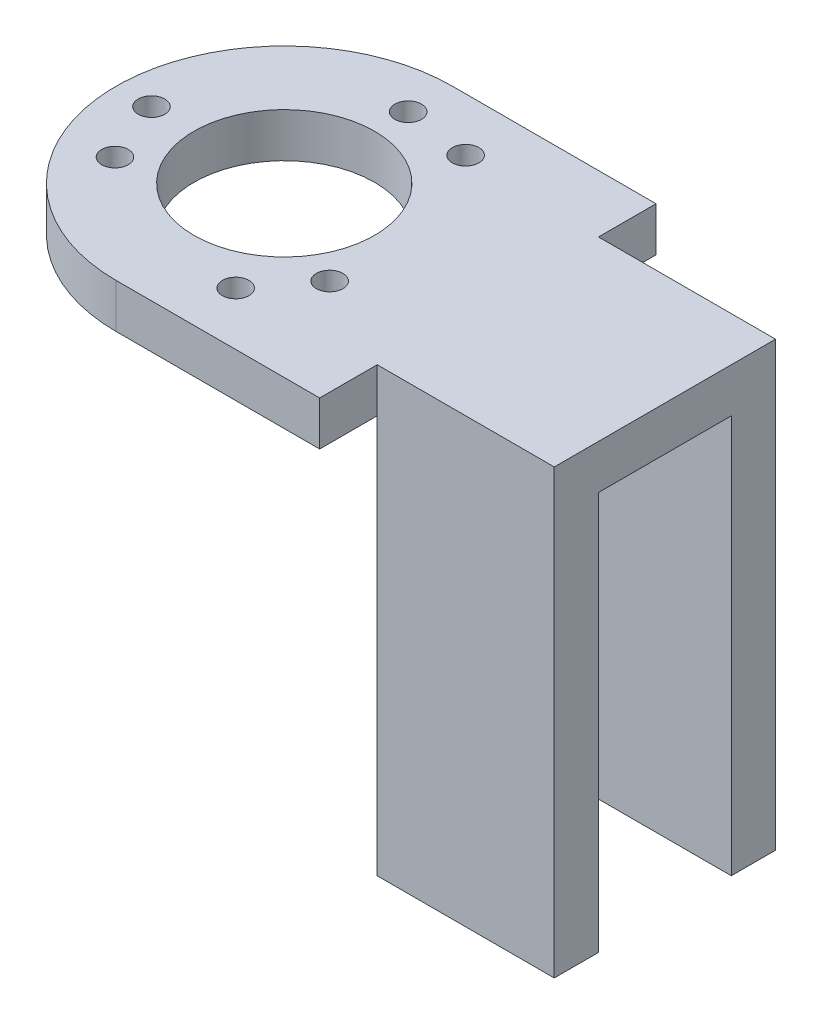
ISO-10303-21;
HEADER;
FILE_DESCRIPTION(('STEP AP214'),'2;1');
FILE_NAME('part.step','',(''),(''),'','','');
FILE_SCHEMA(('AUTOMOTIVE_DESIGN { 1 0 10303 214 1 1 1 1 }'));
ENDSEC;
DATA;
#1=APPLICATION_CONTEXT('core data for automotive mechanical design processes');
#2=APPLICATION_PROTOCOL_DEFINITION('international standard','automotive_design',2000,#1);
#3=PRODUCT_CONTEXT('',#1,'mechanical');
#4=PRODUCT('Part','Part','',(#3));
#5=PRODUCT_RELATED_PRODUCT_CATEGORY('part','',(#4));
#6=PRODUCT_DEFINITION_FORMATION('','',#4);
#7=PRODUCT_DEFINITION_CONTEXT('part definition',#1,'design');
#8=PRODUCT_DEFINITION('design','',#6,#7);
#9=PRODUCT_DEFINITION_SHAPE('','',#8);
#10=(LENGTH_UNIT() NAMED_UNIT(*) SI_UNIT(.MILLI.,.METRE.));
#11=(NAMED_UNIT(*) PLANE_ANGLE_UNIT() SI_UNIT($,.RADIAN.));
#12=(NAMED_UNIT(*) SI_UNIT($,.STERADIAN.) SOLID_ANGLE_UNIT());
#13=UNCERTAINTY_MEASURE_WITH_UNIT(LENGTH_MEASURE(1.E-05),#10,'distance_accuracy_value','');
#14=(GEOMETRIC_REPRESENTATION_CONTEXT(3) GLOBAL_UNCERTAINTY_ASSIGNED_CONTEXT((#13)) GLOBAL_UNIT_ASSIGNED_CONTEXT((#10,
#11,#12)) REPRESENTATION_CONTEXT('',''));
#15=CARTESIAN_POINT('',(0.,0.,0.));
#16=DIRECTION('',(0.,0.,1.));
#17=DIRECTION('',(1.,0.,0.));
#18=AXIS2_PLACEMENT_3D('',#15,#16,#17);
#19=CARTESIAN_POINT('',(23.,0.,0.));
#20=DIRECTION('',(-1.,0.,0.));
#21=DIRECTION('',(0.,0.,1.));
#22=AXIS2_PLACEMENT_3D('',#19,#20,#21);
#23=PLANE('',#22);
#24=DIRECTION('',(0.,-1.,0.));
#25=VECTOR('',#24,1.);
#26=CARTESIAN_POINT('',(23.,5.,12.5));
#27=LINE('',#26,#25);
#28=CARTESIAN_POINT('',(23.,5.,12.5));
#29=VERTEX_POINT('',#28);
#30=CARTESIAN_POINT('',(23.,0.,12.5));
#31=VERTEX_POINT('',#30);
#32=EDGE_CURVE('E208',#29,#31,#27,.T.);
#33=ORIENTED_EDGE('',*,*,#32,.F.);
#34=DIRECTION('',(0.,0.,1.));
#35=VECTOR('',#34,1.);
#36=CARTESIAN_POINT('',(23.,5.,0.));
#37=LINE('',#36,#35);
#38=CARTESIAN_POINT('',(23.,5.,19.));
#39=VERTEX_POINT('',#38);
#40=EDGE_CURVE('E234',#29,#39,#37,.T.);
#41=ORIENTED_EDGE('',*,*,#40,.T.);
#42=DIRECTION('',(0.,1.,0.));
#43=VECTOR('',#42,1.);
#44=CARTESIAN_POINT('',(23.,0.,19.));
#45=LINE('',#44,#43);
#46=CARTESIAN_POINT('',(23.,0.,19.));
#47=VERTEX_POINT('',#46);
#48=EDGE_CURVE('E258',#47,#39,#45,.T.);
#49=ORIENTED_EDGE('',*,*,#48,.F.);
#50=DIRECTION('',(0.,0.,1.));
#51=VECTOR('',#50,1.);
#52=CARTESIAN_POINT('',(23.,0.,0.));
#53=LINE('',#52,#51);
#54=EDGE_CURVE('E240',#31,#47,#53,.T.);
#55=ORIENTED_EDGE('',*,*,#54,.F.);
#56=EDGE_LOOP('',(#33,#41,#49,#55));
#57=FACE_BOUND('',#56,.T.);
#58=ADVANCED_FACE('F41',(#57),#23,.F.);
#59=DIRECTION('',(0.,1.,0.));
#60=VECTOR('',#59,1.);
#61=CARTESIAN_POINT('',(23.,5.,-12.5));
#62=LINE('',#61,#60);
#63=CARTESIAN_POINT('',(23.,0.,-12.5));
#64=VERTEX_POINT('',#63);
#65=CARTESIAN_POINT('',(23.,5.,-12.5));
#66=VERTEX_POINT('',#65);
#67=EDGE_CURVE('E212',#64,#66,#62,.T.);
#68=ORIENTED_EDGE('',*,*,#67,.F.);
#69=CARTESIAN_POINT('',(23.,0.,-19.));
#70=VERTEX_POINT('',#69);
#71=EDGE_CURVE('E235',#70,#64,#53,.T.);
#72=ORIENTED_EDGE('',*,*,#71,.F.);
#73=DIRECTION('',(0.,1.,0.));
#74=VECTOR('',#73,1.);
#75=CARTESIAN_POINT('',(23.,0.,-19.));
#76=LINE('',#75,#74);
#77=CARTESIAN_POINT('',(23.,5.,-19.));
#78=VERTEX_POINT('',#77);
#79=EDGE_CURVE('E247',#70,#78,#76,.T.);
#80=ORIENTED_EDGE('',*,*,#79,.T.);
#81=EDGE_CURVE('E248',#78,#66,#37,.T.);
#82=ORIENTED_EDGE('',*,*,#81,.T.);
#83=EDGE_LOOP('',(#68,#72,#80,#82));
#84=FACE_BOUND('',#83,.T.);
#85=ADVANCED_FACE('F348',(#84),#23,.F.);
#86=CARTESIAN_POINT('',(0.,5.,0.));
#87=DIRECTION('',(0.,-1.,0.));
#88=DIRECTION('',(0.,0.,-1.));
#89=AXIS2_PLACEMENT_3D('',#86,#87,#88);
#90=CYLINDRICAL_SURFACE('',#89,19.);
#91=DIRECTION('',(0.,1.,0.));
#92=VECTOR('',#91,1.);
#93=CARTESIAN_POINT('',(0.,0.,19.));
#94=LINE('',#93,#92);
#95=CARTESIAN_POINT('',(0.,0.,19.));
#96=VERTEX_POINT('',#95);
#97=CARTESIAN_POINT('',(0.,5.,19.));
#98=VERTEX_POINT('',#97);
#99=EDGE_CURVE('E263',#96,#98,#94,.T.);
#100=ORIENTED_EDGE('',*,*,#99,.T.);
#101=CARTESIAN_POINT('',(0.,5.,0.));
#102=DIRECTION('',(0.,1.,0.));
#103=DIRECTION('',(0.,0.,1.));
#104=AXIS2_PLACEMENT_3D('',#101,#102,#103);
#105=CIRCLE('',#104,19.);
#106=CARTESIAN_POINT('',(0.,5.,-19.));
#107=VERTEX_POINT('',#106);
#108=EDGE_CURVE('E11',#107,#98,#105,.T.);
#109=ORIENTED_EDGE('',*,*,#108,.F.);
#110=DIRECTION('',(0.,1.,0.));
#111=VECTOR('',#110,1.);
#112=CARTESIAN_POINT('',(0.,0.,-19.));
#113=LINE('',#112,#111);
#114=CARTESIAN_POINT('',(0.,0.,-19.));
#115=VERTEX_POINT('',#114);
#116=EDGE_CURVE('E267',#115,#107,#113,.T.);
#117=ORIENTED_EDGE('',*,*,#116,.F.);
#118=CARTESIAN_POINT('',(0.,0.,0.));
#119=DIRECTION('',(0.,1.,0.));
#120=DIRECTION('',(0.,0.,1.));
#121=AXIS2_PLACEMENT_3D('',#118,#119,#120);
#122=CIRCLE('',#121,19.);
#123=EDGE_CURVE('E45',#115,#96,#122,.T.);
#124=ORIENTED_EDGE('',*,*,#123,.T.);
#125=EDGE_LOOP('',(#100,#109,#117,#124));
#126=FACE_BOUND('',#125,.T.);
#127=ADVANCED_FACE('F43',(#126),#90,.T.);
#128=CARTESIAN_POINT('',(0.,5.,0.));
#129=DIRECTION('',(0.,1.,0.));
#130=DIRECTION('',(0.,0.,1.));
#131=AXIS2_PLACEMENT_3D('',#128,#129,#130);
#132=PLANE('',#131);
#133=DIRECTION('',(-1.,0.,0.));
#134=VECTOR('',#133,1.);
#135=CARTESIAN_POINT('',(43.,5.,-12.5));
#136=LINE('',#135,#134);
#137=CARTESIAN_POINT('',(43.,5.,-12.5));
#138=VERTEX_POINT('',#137);
#139=EDGE_CURVE('E230',#138,#66,#136,.T.);
#140=ORIENTED_EDGE('',*,*,#139,.T.);
#141=ORIENTED_EDGE('',*,*,#81,.F.);
#142=DIRECTION('',(1.,0.,0.));
#143=VECTOR('',#142,1.);
#144=CARTESIAN_POINT('',(0.,5.,-19.));
#145=LINE('',#144,#143);
#146=EDGE_CURVE('E251',#107,#78,#145,.T.);
#147=ORIENTED_EDGE('',*,*,#146,.F.);
#148=ORIENTED_EDGE('',*,*,#108,.T.);
#149=DIRECTION('',(1.,0.,0.));
#150=VECTOR('',#149,1.);
#151=CARTESIAN_POINT('',(0.,5.,19.));
#152=LINE('',#151,#150);
#153=EDGE_CURVE('E254',#98,#39,#152,.T.);
#154=ORIENTED_EDGE('',*,*,#153,.T.);
#155=ORIENTED_EDGE('',*,*,#40,.F.);
#156=DIRECTION('',(-1.,0.,0.));
#157=VECTOR('',#156,1.);
#158=CARTESIAN_POINT('',(43.,5.,12.5));
#159=LINE('',#158,#157);
#160=CARTESIAN_POINT('',(43.,5.,12.5));
#161=VERTEX_POINT('',#160);
#162=EDGE_CURVE('E221',#161,#29,#159,.T.);
#163=ORIENTED_EDGE('',*,*,#162,.F.);
#164=DIRECTION('',(0.,0.,1.));
#165=VECTOR('',#164,1.);
#166=CARTESIAN_POINT('',(43.,5.,12.5));
#167=LINE('',#166,#165);
#168=EDGE_CURVE('E218',#138,#161,#167,.T.);
#169=ORIENTED_EDGE('',*,*,#168,.F.);
#170=EDGE_LOOP('',(#140,#141,#147,#148,#154,#155,#163,#169));
#171=FACE_BOUND('',#170,.T.);
#172=CARTESIAN_POINT('',(0.,5.,-14.));
#173=DIRECTION('',(0.,1.,0.));
#174=DIRECTION('',(0.,0.,1.));
#175=AXIS2_PLACEMENT_3D('',#172,#173,#174);
#176=CIRCLE('',#175,1.5);
#177=CARTESIAN_POINT('',(0.,5.,-12.5));
#178=VERTEX_POINT('',#177);
#179=EDGE_CURVE('E307',#178,#178,#176,.T.);
#180=ORIENTED_EDGE('',*,*,#179,.F.);
#181=EDGE_LOOP('',(#180));
#182=FACE_BOUND('',#181,.T.);
#183=CARTESIAN_POINT('',(12.1243556529821,5.,7.));
#184=DIRECTION('',(0.,1.,0.));
#185=DIRECTION('',(0.,0.,1.));
#186=AXIS2_PLACEMENT_3D('',#183,#184,#185);
#187=CIRCLE('',#186,1.5);
#188=CARTESIAN_POINT('',(12.1243556529821,5.,8.5));
#189=VERTEX_POINT('',#188);
#190=EDGE_CURVE('E299',#189,#189,#187,.T.);
#191=ORIENTED_EDGE('',*,*,#190,.F.);
#192=EDGE_LOOP('',(#191));
#193=FACE_BOUND('',#192,.T.);
#194=CARTESIAN_POINT('',(7.5,5.,12.9903810567666));
#195=DIRECTION('',(0.,1.,0.));
#196=DIRECTION('',(0.,0.,1.));
#197=AXIS2_PLACEMENT_3D('',#194,#195,#196);
#198=CIRCLE('',#197,1.5);
#199=CARTESIAN_POINT('',(7.5,5.,14.4903810567666));
#200=VERTEX_POINT('',#199);
#201=EDGE_CURVE('E291',#200,#200,#198,.T.);
#202=ORIENTED_EDGE('',*,*,#201,.F.);
#203=EDGE_LOOP('',(#202));
#204=FACE_BOUND('',#203,.T.);
#205=CARTESIAN_POINT('',(-12.1243556529821,5.,7.));
#206=DIRECTION('',(0.,1.,0.));
#207=DIRECTION('',(0.,0.,1.));
#208=AXIS2_PLACEMENT_3D('',#205,#206,#207);
#209=CIRCLE('',#208,1.5);
#210=CARTESIAN_POINT('',(-12.1243556529821,5.,8.5));
#211=VERTEX_POINT('',#210);
#212=EDGE_CURVE('E283',#211,#211,#209,.T.);
#213=ORIENTED_EDGE('',*,*,#212,.F.);
#214=EDGE_LOOP('',(#213));
#215=FACE_BOUND('',#214,.T.);
#216=CARTESIAN_POINT('',(-15.,5.,0.));
#217=DIRECTION('',(0.,1.,0.));
#218=DIRECTION('',(0.,0.,1.));
#219=AXIS2_PLACEMENT_3D('',#216,#217,#218);
#220=CIRCLE('',#219,1.5);
#221=CARTESIAN_POINT('',(-15.,5.,1.5));
#222=VERTEX_POINT('',#221);
#223=EDGE_CURVE('E274',#222,#222,#220,.T.);
#224=ORIENTED_EDGE('',*,*,#223,.F.);
#225=EDGE_LOOP('',(#224));
#226=FACE_BOUND('',#225,.T.);
#227=CARTESIAN_POINT('',(7.49999999999997,5.,-12.9903810567666));
#228=DIRECTION('',(0.,1.,0.));
#229=DIRECTION('',(0.,0.,1.));
#230=AXIS2_PLACEMENT_3D('',#227,#228,#229);
#231=CIRCLE('',#230,1.5);
#232=CARTESIAN_POINT('',(7.49999999999997,5.,-11.4903810567666));
#233=VERTEX_POINT('',#232);
#234=EDGE_CURVE('E278',#233,#233,#231,.T.);
#235=ORIENTED_EDGE('',*,*,#234,.F.);
#236=EDGE_LOOP('',(#235));
#237=FACE_BOUND('',#236,.T.);
#238=CARTESIAN_POINT('',(0.,5.,0.));
#239=DIRECTION('',(0.,1.,0.));
#240=DIRECTION('',(0.,0.,1.));
#241=AXIS2_PLACEMENT_3D('',#238,#239,#240);
#242=CIRCLE('',#241,10.2);
#243=CARTESIAN_POINT('',(0.,5.,10.2));
#244=VERTEX_POINT('',#243);
#245=EDGE_CURVE('E322',#244,#244,#242,.T.);
#246=ORIENTED_EDGE('',*,*,#245,.F.);
#247=EDGE_LOOP('',(#246));
#248=FACE_BOUND('',#247,.T.);
#249=ADVANCED_FACE('F344',(#171,#182,#193,#204,#215,#226,#237,#248),#132,.T.);
#250=CARTESIAN_POINT('',(0.,0.,0.));
#251=DIRECTION('',(0.,1.,0.));
#252=DIRECTION('',(0.,0.,1.));
#253=AXIS2_PLACEMENT_3D('',#250,#251,#252);
#254=PLANE('',#253);
#255=CARTESIAN_POINT('',(0.,0.,-14.));
#256=DIRECTION('',(0.,1.,0.));
#257=DIRECTION('',(0.,0.,1.));
#258=AXIS2_PLACEMENT_3D('',#255,#256,#257);
#259=CIRCLE('',#258,1.5);
#260=CARTESIAN_POINT('',(0.,0.,-12.5));
#261=VERTEX_POINT('',#260);
#262=EDGE_CURVE('E262',#261,#261,#259,.T.);
#263=ORIENTED_EDGE('',*,*,#262,.T.);
#264=EDGE_LOOP('',(#263));
#265=FACE_BOUND('',#264,.T.);
#266=CARTESIAN_POINT('',(12.1243556529821,0.,7.));
#267=DIRECTION('',(0.,1.,0.));
#268=DIRECTION('',(0.,0.,1.));
#269=AXIS2_PLACEMENT_3D('',#266,#267,#268);
#270=CIRCLE('',#269,1.5);
#271=CARTESIAN_POINT('',(12.1243556529821,0.,8.5));
#272=VERTEX_POINT('',#271);
#273=EDGE_CURVE('E303',#272,#272,#270,.T.);
#274=ORIENTED_EDGE('',*,*,#273,.T.);
#275=EDGE_LOOP('',(#274));
#276=FACE_BOUND('',#275,.T.);
#277=CARTESIAN_POINT('',(7.5,0.,12.9903810567666));
#278=DIRECTION('',(0.,1.,0.));
#279=DIRECTION('',(0.,0.,1.));
#280=AXIS2_PLACEMENT_3D('',#277,#278,#279);
#281=CIRCLE('',#280,1.5);
#282=CARTESIAN_POINT('',(7.5,0.,14.4903810567666));
#283=VERTEX_POINT('',#282);
#284=EDGE_CURVE('E295',#283,#283,#281,.T.);
#285=ORIENTED_EDGE('',*,*,#284,.T.);
#286=EDGE_LOOP('',(#285));
#287=FACE_BOUND('',#286,.T.);
#288=CARTESIAN_POINT('',(-12.1243556529821,0.,7.));
#289=DIRECTION('',(0.,1.,0.));
#290=DIRECTION('',(0.,0.,1.));
#291=AXIS2_PLACEMENT_3D('',#288,#289,#290);
#292=CIRCLE('',#291,1.5);
#293=CARTESIAN_POINT('',(-12.1243556529821,0.,8.5));
#294=VERTEX_POINT('',#293);
#295=EDGE_CURVE('E287',#294,#294,#292,.T.);
#296=ORIENTED_EDGE('',*,*,#295,.T.);
#297=EDGE_LOOP('',(#296));
#298=FACE_BOUND('',#297,.T.);
#299=CARTESIAN_POINT('',(-15.,0.,0.));
#300=DIRECTION('',(0.,1.,0.));
#301=DIRECTION('',(0.,0.,1.));
#302=AXIS2_PLACEMENT_3D('',#299,#300,#301);
#303=CIRCLE('',#302,1.5);
#304=CARTESIAN_POINT('',(-15.,0.,1.5));
#305=VERTEX_POINT('',#304);
#306=EDGE_CURVE('E279',#305,#305,#303,.T.);
#307=ORIENTED_EDGE('',*,*,#306,.T.);
#308=EDGE_LOOP('',(#307));
#309=FACE_BOUND('',#308,.T.);
#310=CARTESIAN_POINT('',(7.49999999999997,0.,-12.9903810567666));
#311=DIRECTION('',(0.,1.,0.));
#312=DIRECTION('',(0.,0.,1.));
#313=AXIS2_PLACEMENT_3D('',#310,#311,#312);
#314=CIRCLE('',#313,1.5);
#315=CARTESIAN_POINT('',(7.49999999999997,0.,-11.4903810567666));
#316=VERTEX_POINT('',#315);
#317=EDGE_CURVE('E314',#316,#316,#314,.T.);
#318=ORIENTED_EDGE('',*,*,#317,.T.);
#319=EDGE_LOOP('',(#318));
#320=FACE_BOUND('',#319,.T.);
#321=ORIENTED_EDGE('',*,*,#71,.T.);
#322=DIRECTION('',(0.,0.,1.));
#323=VECTOR('',#322,1.);
#324=CARTESIAN_POINT('',(23.,0.,0.));
#325=LINE('',#324,#323);
#326=CARTESIAN_POINT('',(23.,0.,-7.5));
#327=VERTEX_POINT('',#326);
#328=EDGE_CURVE('E174',#64,#327,#325,.T.);
#329=ORIENTED_EDGE('',*,*,#328,.T.);
#330=DIRECTION('',(-1.,0.,0.));
#331=VECTOR('',#330,1.);
#332=CARTESIAN_POINT('',(0.,0.,-7.5));
#333=LINE('',#332,#331);
#334=CARTESIAN_POINT('',(43.,0.,-7.5));
#335=VERTEX_POINT('',#334);
#336=EDGE_CURVE('E170',#335,#327,#333,.T.);
#337=ORIENTED_EDGE('',*,*,#336,.F.);
#338=DIRECTION('',(0.,0.,-1.));
#339=VECTOR('',#338,1.);
#340=CARTESIAN_POINT('',(43.,0.,12.5));
#341=LINE('',#340,#339);
#342=CARTESIAN_POINT('',(43.,0.,7.5));
#343=VERTEX_POINT('',#342);
#344=EDGE_CURVE('E62',#343,#335,#341,.T.);
#345=ORIENTED_EDGE('',*,*,#344,.F.);
#346=DIRECTION('',(1.,0.,0.));
#347=VECTOR('',#346,1.);
#348=CARTESIAN_POINT('',(0.,0.,7.5));
#349=LINE('',#348,#347);
#350=CARTESIAN_POINT('',(23.,0.,7.5));
#351=VERTEX_POINT('',#350);
#352=EDGE_CURVE('E57',#351,#343,#349,.T.);
#353=ORIENTED_EDGE('',*,*,#352,.F.);
#354=DIRECTION('',(0.,0.,1.));
#355=VECTOR('',#354,1.);
#356=CARTESIAN_POINT('',(23.,0.,0.));
#357=LINE('',#356,#355);
#358=EDGE_CURVE('E205',#351,#31,#357,.T.);
#359=ORIENTED_EDGE('',*,*,#358,.T.);
#360=ORIENTED_EDGE('',*,*,#54,.T.);
#361=DIRECTION('',(1.,0.,0.));
#362=VECTOR('',#361,1.);
#363=CARTESIAN_POINT('',(0.,0.,19.));
#364=LINE('',#363,#362);
#365=EDGE_CURVE('E243',#96,#47,#364,.T.);
#366=ORIENTED_EDGE('',*,*,#365,.F.);
#367=ORIENTED_EDGE('',*,*,#123,.F.);
#368=DIRECTION('',(1.,0.,0.));
#369=VECTOR('',#368,1.);
#370=CARTESIAN_POINT('',(0.,0.,-19.));
#371=LINE('',#370,#369);
#372=EDGE_CURVE('E239',#115,#70,#371,.T.);
#373=ORIENTED_EDGE('',*,*,#372,.T.);
#374=EDGE_LOOP('',(#321,#329,#337,#345,#353,#359,#360,#366,#367,#373));
#375=FACE_BOUND('',#374,.T.);
#376=CARTESIAN_POINT('',(0.,0.,0.));
#377=DIRECTION('',(0.,1.,0.));
#378=DIRECTION('',(0.,0.,1.));
#379=AXIS2_PLACEMENT_3D('',#376,#377,#378);
#380=CIRCLE('',#379,10.2);
#381=CARTESIAN_POINT('',(0.,0.,10.2));
#382=VERTEX_POINT('',#381);
#383=EDGE_CURVE('E318',#382,#382,#380,.T.);
#384=ORIENTED_EDGE('',*,*,#383,.T.);
#385=EDGE_LOOP('',(#384));
#386=FACE_BOUND('',#385,.T.);
#387=ADVANCED_FACE('F330',(#265,#276,#287,#298,#309,#320,#375,#386),#254,.F.);
#388=CARTESIAN_POINT('',(0.,5.,0.));
#389=DIRECTION('',(0.,-1.,0.));
#390=DIRECTION('',(0.,0.,-1.));
#391=AXIS2_PLACEMENT_3D('',#388,#389,#390);
#392=CYLINDRICAL_SURFACE('',#391,10.2);
#393=ORIENTED_EDGE('',*,*,#245,.T.);
#394=EDGE_LOOP('',(#393));
#395=FACE_BOUND('',#394,.T.);
#396=ORIENTED_EDGE('',*,*,#383,.F.);
#397=EDGE_LOOP('',(#396));
#398=FACE_BOUND('',#397,.T.);
#399=ADVANCED_FACE('F332',(#395,#398),#392,.F.);
#400=CARTESIAN_POINT('',(7.49999999999997,0.,-12.9903810567666));
#401=DIRECTION('',(0.,1.,0.));
#402=DIRECTION('',(0.,0.,1.));
#403=AXIS2_PLACEMENT_3D('',#400,#401,#402);
#404=CYLINDRICAL_SURFACE('',#403,1.5);
#405=ORIENTED_EDGE('',*,*,#317,.F.);
#406=EDGE_LOOP('',(#405));
#407=FACE_BOUND('',#406,.T.);
#408=ORIENTED_EDGE('',*,*,#234,.T.);
#409=EDGE_LOOP('',(#408));
#410=FACE_BOUND('',#409,.T.);
#411=ADVANCED_FACE('F334',(#407,#410),#404,.F.);
#412=CARTESIAN_POINT('',(-15.,0.,0.));
#413=DIRECTION('',(0.,1.,0.));
#414=DIRECTION('',(0.,0.,1.));
#415=AXIS2_PLACEMENT_3D('',#412,#413,#414);
#416=CYLINDRICAL_SURFACE('',#415,1.5);
#417=ORIENTED_EDGE('',*,*,#306,.F.);
#418=EDGE_LOOP('',(#417));
#419=FACE_BOUND('',#418,.T.);
#420=ORIENTED_EDGE('',*,*,#223,.T.);
#421=EDGE_LOOP('',(#420));
#422=FACE_BOUND('',#421,.T.);
#423=ADVANCED_FACE('F341',(#419,#422),#416,.F.);
#424=CARTESIAN_POINT('',(-12.1243556529821,0.,7.));
#425=DIRECTION('',(0.,1.,0.));
#426=DIRECTION('',(0.,0.,1.));
#427=AXIS2_PLACEMENT_3D('',#424,#425,#426);
#428=CYLINDRICAL_SURFACE('',#427,1.5);
#429=ORIENTED_EDGE('',*,*,#295,.F.);
#430=EDGE_LOOP('',(#429));
#431=FACE_BOUND('',#430,.T.);
#432=ORIENTED_EDGE('',*,*,#212,.T.);
#433=EDGE_LOOP('',(#432));
#434=FACE_BOUND('',#433,.T.);
#435=ADVANCED_FACE('F361',(#431,#434),#428,.F.);
#436=CARTESIAN_POINT('',(7.5,0.,12.9903810567666));
#437=DIRECTION('',(0.,1.,0.));
#438=DIRECTION('',(0.,0.,1.));
#439=AXIS2_PLACEMENT_3D('',#436,#437,#438);
#440=CYLINDRICAL_SURFACE('',#439,1.5);
#441=ORIENTED_EDGE('',*,*,#284,.F.);
#442=EDGE_LOOP('',(#441));
#443=FACE_BOUND('',#442,.T.);
#444=ORIENTED_EDGE('',*,*,#201,.T.);
#445=EDGE_LOOP('',(#444));
#446=FACE_BOUND('',#445,.T.);
#447=ADVANCED_FACE('F365',(#443,#446),#440,.F.);
#448=CARTESIAN_POINT('',(12.1243556529821,0.,7.));
#449=DIRECTION('',(0.,1.,0.));
#450=DIRECTION('',(0.,0.,1.));
#451=AXIS2_PLACEMENT_3D('',#448,#449,#450);
#452=CYLINDRICAL_SURFACE('',#451,1.5);
#453=ORIENTED_EDGE('',*,*,#273,.F.);
#454=EDGE_LOOP('',(#453));
#455=FACE_BOUND('',#454,.T.);
#456=ORIENTED_EDGE('',*,*,#190,.T.);
#457=EDGE_LOOP('',(#456));
#458=FACE_BOUND('',#457,.T.);
#459=ADVANCED_FACE('F369',(#455,#458),#452,.F.);
#460=CARTESIAN_POINT('',(0.,0.,-14.));
#461=DIRECTION('',(0.,1.,0.));
#462=DIRECTION('',(0.,0.,1.));
#463=AXIS2_PLACEMENT_3D('',#460,#461,#462);
#464=CYLINDRICAL_SURFACE('',#463,1.5);
#465=ORIENTED_EDGE('',*,*,#262,.F.);
#466=EDGE_LOOP('',(#465));
#467=FACE_BOUND('',#466,.T.);
#468=ORIENTED_EDGE('',*,*,#179,.T.);
#469=EDGE_LOOP('',(#468));
#470=FACE_BOUND('',#469,.T.);
#471=ADVANCED_FACE('F373',(#467,#470),#464,.F.);
#472=CARTESIAN_POINT('',(0.,0.,19.));
#473=DIRECTION('',(0.,0.,1.));
#474=DIRECTION('',(1.,0.,0.));
#475=AXIS2_PLACEMENT_3D('',#472,#473,#474);
#476=PLANE('',#475);
#477=ORIENTED_EDGE('',*,*,#153,.F.);
#478=ORIENTED_EDGE('',*,*,#99,.F.);
#479=ORIENTED_EDGE('',*,*,#365,.T.);
#480=ORIENTED_EDGE('',*,*,#48,.T.);
#481=EDGE_LOOP('',(#477,#478,#479,#480));
#482=FACE_BOUND('',#481,.T.);
#483=ADVANCED_FACE('F376',(#482),#476,.T.);
#484=CARTESIAN_POINT('',(0.,0.,-19.));
#485=DIRECTION('',(0.,0.,1.));
#486=DIRECTION('',(1.,0.,0.));
#487=AXIS2_PLACEMENT_3D('',#484,#485,#486);
#488=PLANE('',#487);
#489=ORIENTED_EDGE('',*,*,#146,.T.);
#490=ORIENTED_EDGE('',*,*,#79,.F.);
#491=ORIENTED_EDGE('',*,*,#372,.F.);
#492=ORIENTED_EDGE('',*,*,#116,.T.);
#493=EDGE_LOOP('',(#489,#490,#491,#492));
#494=FACE_BOUND('',#493,.T.);
#495=ADVANCED_FACE('F357',(#494),#488,.F.);
#496=CARTESIAN_POINT('',(43.,5.,12.5));
#497=DIRECTION('',(0.,0.,-1.));
#498=DIRECTION('',(-1.,0.,0.));
#499=AXIS2_PLACEMENT_3D('',#496,#497,#498);
#500=PLANE('',#499);
#501=ORIENTED_EDGE('',*,*,#32,.T.);
#502=DIRECTION('',(0.,-1.,0.));
#503=VECTOR('',#502,1.);
#504=CARTESIAN_POINT('',(23.,5.,12.5));
#505=LINE('',#504,#503);
#506=CARTESIAN_POINT('',(23.,-45.,12.5));
#507=VERTEX_POINT('',#506);
#508=EDGE_CURVE('E178',#31,#507,#505,.T.);
#509=ORIENTED_EDGE('',*,*,#508,.T.);
#510=DIRECTION('',(1.,0.,0.));
#511=VECTOR('',#510,1.);
#512=CARTESIAN_POINT('',(23.,-45.,12.5));
#513=LINE('',#512,#511);
#514=CARTESIAN_POINT('',(43.,-45.,12.5));
#515=VERTEX_POINT('',#514);
#516=EDGE_CURVE('E183',#507,#515,#513,.T.);
#517=ORIENTED_EDGE('',*,*,#516,.T.);
#518=DIRECTION('',(0.,-1.,0.));
#519=VECTOR('',#518,1.);
#520=CARTESIAN_POINT('',(43.,5.,12.5));
#521=LINE('',#520,#519);
#522=EDGE_CURVE('E209',#161,#515,#521,.T.);
#523=ORIENTED_EDGE('',*,*,#522,.F.);
#524=ORIENTED_EDGE('',*,*,#162,.T.);
#525=EDGE_LOOP('',(#501,#509,#517,#523,#524));
#526=FACE_BOUND('',#525,.T.);
#527=ADVANCED_FACE('F434',(#526),#500,.F.);
#528=CARTESIAN_POINT('',(43.,5.,-12.5));
#529=DIRECTION('',(0.,0.,1.));
#530=DIRECTION('',(1.,0.,0.));
#531=AXIS2_PLACEMENT_3D('',#528,#529,#530);
#532=PLANE('',#531);
#533=ORIENTED_EDGE('',*,*,#67,.T.);
#534=ORIENTED_EDGE('',*,*,#139,.F.);
#535=DIRECTION('',(0.,1.,0.));
#536=VECTOR('',#535,1.);
#537=CARTESIAN_POINT('',(43.,5.,-12.5));
#538=LINE('',#537,#536);
#539=CARTESIAN_POINT('',(43.,-45.,-12.5));
#540=VERTEX_POINT('',#539);
#541=EDGE_CURVE('E215',#540,#138,#538,.T.);
#542=ORIENTED_EDGE('',*,*,#541,.F.);
#543=DIRECTION('',(-1.,0.,0.));
#544=VECTOR('',#543,1.);
#545=CARTESIAN_POINT('',(43.,-45.,-12.5));
#546=LINE('',#545,#544);
#547=CARTESIAN_POINT('',(23.,-45.,-12.5));
#548=VERTEX_POINT('',#547);
#549=EDGE_CURVE('E152',#540,#548,#546,.T.);
#550=ORIENTED_EDGE('',*,*,#549,.T.);
#551=DIRECTION('',(0.,1.,0.));
#552=VECTOR('',#551,1.);
#553=CARTESIAN_POINT('',(23.,5.,-12.5));
#554=LINE('',#553,#552);
#555=EDGE_CURVE('E146',#548,#64,#554,.T.);
#556=ORIENTED_EDGE('',*,*,#555,.T.);
#557=EDGE_LOOP('',(#533,#534,#542,#550,#556));
#558=FACE_BOUND('',#557,.T.);
#559=ADVANCED_FACE('F414',(#558),#532,.F.);
#560=CARTESIAN_POINT('',(43.,0.,0.));
#561=DIRECTION('',(1.,0.,0.));
#562=DIRECTION('',(0.,0.,-1.));
#563=AXIS2_PLACEMENT_3D('',#560,#561,#562);
#564=PLANE('',#563);
#565=ORIENTED_EDGE('',*,*,#168,.T.);
#566=ORIENTED_EDGE('',*,*,#522,.T.);
#567=DIRECTION('',(0.,0.,1.));
#568=VECTOR('',#567,1.);
#569=CARTESIAN_POINT('',(43.,-45.,7.5));
#570=LINE('',#569,#568);
#571=CARTESIAN_POINT('',(43.,-45.,7.5));
#572=VERTEX_POINT('',#571);
#573=EDGE_CURVE('E196',#572,#515,#570,.T.);
#574=ORIENTED_EDGE('',*,*,#573,.F.);
#575=DIRECTION('',(0.,1.,0.));
#576=VECTOR('',#575,1.);
#577=CARTESIAN_POINT('',(43.,5.,7.5));
#578=LINE('',#577,#576);
#579=EDGE_CURVE('E187',#572,#343,#578,.T.);
#580=ORIENTED_EDGE('',*,*,#579,.T.);
#581=ORIENTED_EDGE('',*,*,#344,.T.);
#582=DIRECTION('',(0.,-1.,0.));
#583=VECTOR('',#582,1.);
#584=CARTESIAN_POINT('',(43.,5.,-7.5));
#585=LINE('',#584,#583);
#586=CARTESIAN_POINT('',(43.,-45.,-7.5));
#587=VERTEX_POINT('',#586);
#588=EDGE_CURVE('E136',#335,#587,#585,.T.);
#589=ORIENTED_EDGE('',*,*,#588,.T.);
#590=DIRECTION('',(0.,0.,-1.));
#591=VECTOR('',#590,1.);
#592=CARTESIAN_POINT('',(43.,-45.,-7.5));
#593=LINE('',#592,#591);
#594=EDGE_CURVE('E139',#587,#540,#593,.T.);
#595=ORIENTED_EDGE('',*,*,#594,.T.);
#596=ORIENTED_EDGE('',*,*,#541,.T.);
#597=EDGE_LOOP('',(#565,#566,#574,#580,#581,#589,#595,#596));
#598=FACE_BOUND('',#597,.T.);
#599=ADVANCED_FACE('F138',(#598),#564,.T.);
#600=CARTESIAN_POINT('',(23.,5.,7.5));
#601=DIRECTION('',(-1.,0.,0.));
#602=DIRECTION('',(0.,-1.,0.));
#603=AXIS2_PLACEMENT_3D('',#600,#601,#602);
#604=PLANE('',#603);
#605=ORIENTED_EDGE('',*,*,#358,.F.);
#606=DIRECTION('',(0.,-1.,0.));
#607=VECTOR('',#606,1.);
#608=CARTESIAN_POINT('',(23.,5.,7.5));
#609=LINE('',#608,#607);
#610=CARTESIAN_POINT('',(23.,-45.,7.5));
#611=VERTEX_POINT('',#610);
#612=EDGE_CURVE('E179',#351,#611,#609,.T.);
#613=ORIENTED_EDGE('',*,*,#612,.T.);
#614=DIRECTION('',(0.,0.,1.));
#615=VECTOR('',#614,1.);
#616=CARTESIAN_POINT('',(23.,-45.,7.5));
#617=LINE('',#616,#615);
#618=EDGE_CURVE('E190',#611,#507,#617,.T.);
#619=ORIENTED_EDGE('',*,*,#618,.T.);
#620=ORIENTED_EDGE('',*,*,#508,.F.);
#621=EDGE_LOOP('',(#605,#613,#619,#620));
#622=FACE_BOUND('',#621,.T.);
#623=ADVANCED_FACE('F445',(#622),#604,.T.);
#624=CARTESIAN_POINT('',(0.,0.,7.5));
#625=DIRECTION('',(0.,0.,1.));
#626=DIRECTION('',(1.,0.,0.));
#627=AXIS2_PLACEMENT_3D('',#624,#625,#626);
#628=PLANE('',#627);
#629=ORIENTED_EDGE('',*,*,#612,.F.);
#630=ORIENTED_EDGE('',*,*,#352,.T.);
#631=ORIENTED_EDGE('',*,*,#579,.F.);
#632=DIRECTION('',(1.,0.,0.));
#633=VECTOR('',#632,1.);
#634=CARTESIAN_POINT('',(23.,-45.,7.5));
#635=LINE('',#634,#633);
#636=EDGE_CURVE('E182',#611,#572,#635,.T.);
#637=ORIENTED_EDGE('',*,*,#636,.F.);
#638=EDGE_LOOP('',(#629,#630,#631,#637));
#639=FACE_BOUND('',#638,.T.);
#640=ADVANCED_FACE('F443',(#639),#628,.F.);
#641=CARTESIAN_POINT('',(23.,-45.,7.5));
#642=DIRECTION('',(0.,-1.,0.));
#643=DIRECTION('',(0.,0.,-1.));
#644=AXIS2_PLACEMENT_3D('',#641,#642,#643);
#645=PLANE('',#644);
#646=ORIENTED_EDGE('',*,*,#516,.F.);
#647=ORIENTED_EDGE('',*,*,#618,.F.);
#648=ORIENTED_EDGE('',*,*,#636,.T.);
#649=ORIENTED_EDGE('',*,*,#573,.T.);
#650=EDGE_LOOP('',(#646,#647,#648,#649));
#651=FACE_BOUND('',#650,.T.);
#652=ADVANCED_FACE('F438',(#651),#645,.T.);
#653=CARTESIAN_POINT('',(23.,5.,-7.5));
#654=DIRECTION('',(-1.,0.,0.));
#655=DIRECTION('',(0.,0.,1.));
#656=AXIS2_PLACEMENT_3D('',#653,#654,#655);
#657=PLANE('',#656);
#658=ORIENTED_EDGE('',*,*,#328,.F.);
#659=ORIENTED_EDGE('',*,*,#555,.F.);
#660=DIRECTION('',(0.,0.,-1.));
#661=VECTOR('',#660,1.);
#662=CARTESIAN_POINT('',(23.,-45.,-7.5));
#663=LINE('',#662,#661);
#664=CARTESIAN_POINT('',(23.,-45.,-7.5));
#665=VERTEX_POINT('',#664);
#666=EDGE_CURVE('E154',#665,#548,#663,.T.);
#667=ORIENTED_EDGE('',*,*,#666,.F.);
#668=DIRECTION('',(0.,1.,0.));
#669=VECTOR('',#668,1.);
#670=CARTESIAN_POINT('',(23.,5.,-7.5));
#671=LINE('',#670,#669);
#672=EDGE_CURVE('E155',#665,#327,#671,.T.);
#673=ORIENTED_EDGE('',*,*,#672,.T.);
#674=EDGE_LOOP('',(#658,#659,#667,#673));
#675=FACE_BOUND('',#674,.T.);
#676=ADVANCED_FACE('F580',(#675),#657,.T.);
#677=CARTESIAN_POINT('',(0.,0.,-7.5));
#678=DIRECTION('',(0.,0.,-1.));
#679=DIRECTION('',(-1.,0.,0.));
#680=AXIS2_PLACEMENT_3D('',#677,#678,#679);
#681=PLANE('',#680);
#682=ORIENTED_EDGE('',*,*,#588,.F.);
#683=ORIENTED_EDGE('',*,*,#336,.T.);
#684=ORIENTED_EDGE('',*,*,#672,.F.);
#685=DIRECTION('',(-1.,0.,0.));
#686=VECTOR('',#685,1.);
#687=CARTESIAN_POINT('',(43.,-45.,-7.5));
#688=LINE('',#687,#686);
#689=EDGE_CURVE('E145',#587,#665,#688,.T.);
#690=ORIENTED_EDGE('',*,*,#689,.F.);
#691=EDGE_LOOP('',(#682,#683,#684,#690));
#692=FACE_BOUND('',#691,.T.);
#693=ADVANCED_FACE('F158',(#692),#681,.F.);
#694=CARTESIAN_POINT('',(43.,-45.,-7.5));
#695=DIRECTION('',(0.,-1.,0.));
#696=DIRECTION('',(0.,0.,-1.));
#697=AXIS2_PLACEMENT_3D('',#694,#695,#696);
#698=PLANE('',#697);
#699=ORIENTED_EDGE('',*,*,#549,.F.);
#700=ORIENTED_EDGE('',*,*,#594,.F.);
#701=ORIENTED_EDGE('',*,*,#689,.T.);
#702=ORIENTED_EDGE('',*,*,#666,.T.);
#703=EDGE_LOOP('',(#699,#700,#701,#702));
#704=FACE_BOUND('',#703,.T.);
#705=ADVANCED_FACE('F150',(#704),#698,.T.);
#706=CLOSED_SHELL('',(#58,#85,#127,#249,#387,#399,#411,#423,#435,#447,#459,#471,#483,#495,#527,
#559,#599,#623,#640,#652,#676,#693,#705));
#707=MANIFOLD_SOLID_BREP('B2',#706);
#708=ADVANCED_BREP_SHAPE_REPRESENTATION('',(#18,#707),#14);
#709=SHAPE_DEFINITION_REPRESENTATION(#9,#708);
ENDSEC;
END-ISO-10303-21;
